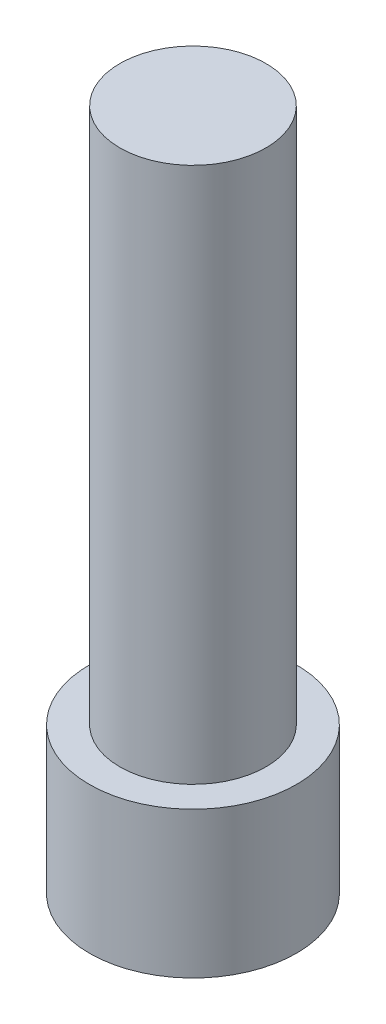
ISO-10303-21;
HEADER;
FILE_DESCRIPTION(('STEP AP214'),'2;1');
FILE_NAME('part.step','',(''),(''),'','','');
FILE_SCHEMA(('AUTOMOTIVE_DESIGN { 1 0 10303 214 1 1 1 1 }'));
ENDSEC;
DATA;
#1=APPLICATION_CONTEXT('core data for automotive mechanical design processes');
#2=APPLICATION_PROTOCOL_DEFINITION('international standard','automotive_design',2000,#1);
#3=PRODUCT_CONTEXT('',#1,'mechanical');
#4=PRODUCT('Part','Part','',(#3));
#5=PRODUCT_RELATED_PRODUCT_CATEGORY('part','',(#4));
#6=PRODUCT_DEFINITION_FORMATION('','',#4);
#7=PRODUCT_DEFINITION_CONTEXT('part definition',#1,'design');
#8=PRODUCT_DEFINITION('design','',#6,#7);
#9=PRODUCT_DEFINITION_SHAPE('','',#8);
#10=(LENGTH_UNIT() NAMED_UNIT(*) SI_UNIT(.MILLI.,.METRE.));
#11=(NAMED_UNIT(*) PLANE_ANGLE_UNIT() SI_UNIT($,.RADIAN.));
#12=(NAMED_UNIT(*) SI_UNIT($,.STERADIAN.) SOLID_ANGLE_UNIT());
#13=UNCERTAINTY_MEASURE_WITH_UNIT(LENGTH_MEASURE(1.E-05),#10,'distance_accuracy_value','');
#14=(GEOMETRIC_REPRESENTATION_CONTEXT(3) GLOBAL_UNCERTAINTY_ASSIGNED_CONTEXT((#13)) GLOBAL_UNIT_ASSIGNED_CONTEXT((#10,
#11,#12)) REPRESENTATION_CONTEXT('',''));
#15=CARTESIAN_POINT('',(0.,0.,0.));
#16=DIRECTION('',(0.,0.,1.));
#17=DIRECTION('',(1.,0.,0.));
#18=AXIS2_PLACEMENT_3D('',#15,#16,#17);
#19=CARTESIAN_POINT('',(0.,6.,0.));
#20=DIRECTION('',(0.,-1.,0.));
#21=DIRECTION('',(0.,0.,-1.));
#22=AXIS2_PLACEMENT_3D('',#19,#20,#21);
#23=CYLINDRICAL_SURFACE('',#22,4.25);
#24=CARTESIAN_POINT('',(0.,6.,0.));
#25=DIRECTION('',(0.,1.,0.));
#26=DIRECTION('',(0.,0.,1.));
#27=AXIS2_PLACEMENT_3D('',#24,#25,#26);
#28=CIRCLE('',#27,4.25);
#29=CARTESIAN_POINT('',(0.,6.,4.25));
#30=VERTEX_POINT('',#29);
#31=EDGE_CURVE('E51',#30,#30,#28,.T.);
#32=ORIENTED_EDGE('',*,*,#31,.F.);
#33=EDGE_LOOP('',(#32));
#34=FACE_BOUND('',#33,.T.);
#35=CARTESIAN_POINT('',(0.,0.,0.));
#36=DIRECTION('',(0.,1.,0.));
#37=DIRECTION('',(0.,0.,1.));
#38=AXIS2_PLACEMENT_3D('',#35,#36,#37);
#39=CIRCLE('',#38,4.25);
#40=CARTESIAN_POINT('',(0.,0.,4.25));
#41=VERTEX_POINT('',#40);
#42=EDGE_CURVE('E46',#41,#41,#39,.T.);
#43=ORIENTED_EDGE('',*,*,#42,.T.);
#44=EDGE_LOOP('',(#43));
#45=FACE_BOUND('',#44,.T.);
#46=ADVANCED_FACE('F43',(#34,#45),#23,.T.);
#47=CARTESIAN_POINT('',(0.,6.,0.));
#48=DIRECTION('',(0.,1.,0.));
#49=DIRECTION('',(0.,0.,1.));
#50=AXIS2_PLACEMENT_3D('',#47,#48,#49);
#51=PLANE('',#50);
#52=CARTESIAN_POINT('',(0.,6.,0.));
#53=DIRECTION('',(0.,1.,0.));
#54=DIRECTION('',(0.,0.,1.));
#55=AXIS2_PLACEMENT_3D('',#52,#53,#54);
#56=CIRCLE('',#55,3.);
#57=CARTESIAN_POINT('',(0.,6.,3.));
#58=VERTEX_POINT('',#57);
#59=EDGE_CURVE('E11',#58,#58,#56,.T.);
#60=ORIENTED_EDGE('',*,*,#59,.F.);
#61=EDGE_LOOP('',(#60));
#62=FACE_BOUND('',#61,.T.);
#63=ORIENTED_EDGE('',*,*,#31,.T.);
#64=EDGE_LOOP('',(#63));
#65=FACE_BOUND('',#64,.T.);
#66=ADVANCED_FACE('F162',(#62,#65),#51,.T.);
#67=CARTESIAN_POINT('',(0.,0.,0.));
#68=DIRECTION('',(0.,1.,0.));
#69=DIRECTION('',(0.,0.,1.));
#70=AXIS2_PLACEMENT_3D('',#67,#68,#69);
#71=PLANE('',#70);
#72=DIRECTION('',(0.091692466270765,0.,0.995787372700209));
#73=VECTOR('',#72,1.);
#74=CARTESIAN_POINT('',(2.3571217565403,0.,-1.66652643488715));
#75=LINE('',#74,#73);
#76=CARTESIAN_POINT('',(2.3571217565403,0.,-1.66652643488715));
#77=VERTEX_POINT('',#76);
#78=CARTESIAN_POINT('',(2.62181510696074,0.,1.20806410353333));
#79=VERTEX_POINT('',#78);
#80=EDGE_CURVE('E134',#77,#79,#75,.T.);
#81=ORIENTED_EDGE('',*,*,#80,.F.);
#82=DIRECTION('',(0.908223394661526,0.,0.418485681223974));
#83=VECTOR('',#82,1.);
#84=CARTESIAN_POINT('',(-0.264693350420435,0.,-2.87459053842048));
#85=LINE('',#84,#83);
#86=CARTESIAN_POINT('',(-0.264693350420435,0.,-2.87459053842048));
#87=VERTEX_POINT('',#86);
#88=EDGE_CURVE('E56',#87,#77,#85,.T.);
#89=ORIENTED_EDGE('',*,*,#88,.F.);
#90=DIRECTION('',(0.816530928390761,0.,-0.577301691476235));
#91=VECTOR('',#90,1.);
#92=CARTESIAN_POINT('',(-2.62181510696074,0.,-1.20806410353333));
#93=LINE('',#92,#91);
#94=CARTESIAN_POINT('',(-2.62181510696074,0.,-1.20806410353333));
#95=VERTEX_POINT('',#94);
#96=EDGE_CURVE('E142',#95,#87,#93,.T.);
#97=ORIENTED_EDGE('',*,*,#96,.F.);
#98=DIRECTION('',(-0.0916924662707653,0.,-0.995787372700209));
#99=VECTOR('',#98,1.);
#100=CARTESIAN_POINT('',(-2.3571217565403,0.,1.66652643488715));
#101=LINE('',#100,#99);
#102=CARTESIAN_POINT('',(-2.3571217565403,0.,1.66652643488715));
#103=VERTEX_POINT('',#102);
#104=EDGE_CURVE('E137',#103,#95,#101,.T.);
#105=ORIENTED_EDGE('',*,*,#104,.F.);
#106=DIRECTION('',(-0.908223394661526,0.,-0.418485681223974));
#107=VECTOR('',#106,1.);
#108=CARTESIAN_POINT('',(0.264693350420435,0.,2.87459053842048));
#109=LINE('',#108,#107);
#110=CARTESIAN_POINT('',(0.264693350420435,0.,2.87459053842048));
#111=VERTEX_POINT('',#110);
#112=EDGE_CURVE('E110',#111,#103,#109,.T.);
#113=ORIENTED_EDGE('',*,*,#112,.F.);
#114=DIRECTION('',(-0.816530928390761,0.,0.577301691476235));
#115=VECTOR('',#114,1.);
#116=CARTESIAN_POINT('',(2.62181510696074,0.,1.20806410353333));
#117=LINE('',#116,#115);
#118=EDGE_CURVE('E139',#79,#111,#117,.T.);
#119=ORIENTED_EDGE('',*,*,#118,.F.);
#120=EDGE_LOOP('',(#81,#89,#97,#105,#113,#119));
#121=FACE_BOUND('',#120,.T.);
#122=ORIENTED_EDGE('',*,*,#42,.F.);
#123=EDGE_LOOP('',(#122));
#124=FACE_BOUND('',#123,.T.);
#125=ADVANCED_FACE('F159',(#121,#124),#71,.F.);
#126=CARTESIAN_POINT('',(0.,28.,0.));
#127=DIRECTION('',(0.,-1.,0.));
#128=DIRECTION('',(0.,0.,-1.));
#129=AXIS2_PLACEMENT_3D('',#126,#127,#128);
#130=CYLINDRICAL_SURFACE('',#129,3.);
#131=CARTESIAN_POINT('',(0.,28.,0.));
#132=DIRECTION('',(0.,1.,0.));
#133=DIRECTION('',(0.,0.,1.));
#134=AXIS2_PLACEMENT_3D('',#131,#132,#133);
#135=CIRCLE('',#134,3.);
#136=CARTESIAN_POINT('',(0.,28.,3.));
#137=VERTEX_POINT('',#136);
#138=EDGE_CURVE('E148',#137,#137,#135,.T.);
#139=ORIENTED_EDGE('',*,*,#138,.F.);
#140=EDGE_LOOP('',(#139));
#141=FACE_BOUND('',#140,.T.);
#142=ORIENTED_EDGE('',*,*,#59,.T.);
#143=EDGE_LOOP('',(#142));
#144=FACE_BOUND('',#143,.T.);
#145=ADVANCED_FACE('F165',(#141,#144),#130,.T.);
#146=CARTESIAN_POINT('',(0.,28.,0.));
#147=DIRECTION('',(0.,1.,0.));
#148=DIRECTION('',(0.,0.,1.));
#149=AXIS2_PLACEMENT_3D('',#146,#147,#148);
#150=PLANE('',#149);
#151=ORIENTED_EDGE('',*,*,#138,.T.);
#152=EDGE_LOOP('',(#151));
#153=FACE_BOUND('',#152,.T.);
#154=ADVANCED_FACE('F168',(#153),#150,.T.);
#155=CARTESIAN_POINT('',(-0.264693350420435,3.,-2.87459053842048));
#156=DIRECTION('',(0.418485681223974,0.,-0.908223394661526));
#157=DIRECTION('',(-0.908223394661526,0.,-0.418485681223974));
#158=AXIS2_PLACEMENT_3D('',#155,#156,#157);
#159=PLANE('',#158);
#160=ORIENTED_EDGE('',*,*,#88,.T.);
#161=DIRECTION('',(0.,-1.,0.));
#162=VECTOR('',#161,1.);
#163=CARTESIAN_POINT('',(2.3571217565403,3.,-1.66652643488715));
#164=LINE('',#163,#162);
#165=CARTESIAN_POINT('',(2.3571217565403,3.,-1.66652643488715));
#166=VERTEX_POINT('',#165);
#167=EDGE_CURVE('E90',#166,#77,#164,.T.);
#168=ORIENTED_EDGE('',*,*,#167,.F.);
#169=DIRECTION('',(0.908223394661526,0.,0.418485681223974));
#170=VECTOR('',#169,1.);
#171=CARTESIAN_POINT('',(-0.264693350420435,3.,-2.87459053842048));
#172=LINE('',#171,#170);
#173=CARTESIAN_POINT('',(-0.264693350420435,3.,-2.87459053842048));
#174=VERTEX_POINT('',#173);
#175=EDGE_CURVE('E145',#174,#166,#172,.T.);
#176=ORIENTED_EDGE('',*,*,#175,.F.);
#177=DIRECTION('',(0.,-1.,0.));
#178=VECTOR('',#177,1.);
#179=CARTESIAN_POINT('',(-0.264693350420435,3.,-2.87459053842048));
#180=LINE('',#179,#178);
#181=EDGE_CURVE('E66',#174,#87,#180,.T.);
#182=ORIENTED_EDGE('',*,*,#181,.T.);
#183=EDGE_LOOP('',(#160,#168,#176,#182));
#184=FACE_BOUND('',#183,.T.);
#185=ADVANCED_FACE('F196',(#184),#159,.F.);
#186=CARTESIAN_POINT('',(-2.62181510696074,3.,-1.20806410353333));
#187=DIRECTION('',(-0.577301691476235,0.,-0.816530928390761));
#188=DIRECTION('',(-0.816530928390761,0.,0.577301691476235));
#189=AXIS2_PLACEMENT_3D('',#186,#187,#188);
#190=PLANE('',#189);
#191=ORIENTED_EDGE('',*,*,#96,.T.);
#192=ORIENTED_EDGE('',*,*,#181,.F.);
#193=DIRECTION('',(0.816530928390761,0.,-0.577301691476235));
#194=VECTOR('',#193,1.);
#195=CARTESIAN_POINT('',(-2.62181510696074,3.,-1.20806410353333));
#196=LINE('',#195,#194);
#197=CARTESIAN_POINT('',(-2.62181510696074,3.,-1.20806410353333));
#198=VERTEX_POINT('',#197);
#199=EDGE_CURVE('E118',#198,#174,#196,.T.);
#200=ORIENTED_EDGE('',*,*,#199,.F.);
#201=DIRECTION('',(0.,-1.,0.));
#202=VECTOR('',#201,1.);
#203=CARTESIAN_POINT('',(-2.62181510696074,3.,-1.20806410353333));
#204=LINE('',#203,#202);
#205=EDGE_CURVE('E112',#198,#95,#204,.T.);
#206=ORIENTED_EDGE('',*,*,#205,.T.);
#207=EDGE_LOOP('',(#191,#192,#200,#206));
#208=FACE_BOUND('',#207,.T.);
#209=ADVANCED_FACE('F209',(#208),#190,.F.);
#210=CARTESIAN_POINT('',(-2.3571217565403,3.,1.66652643488715));
#211=DIRECTION('',(-0.995787372700209,0.,0.0916924662707653));
#212=DIRECTION('',(0.0916924662707653,0.,0.995787372700209));
#213=AXIS2_PLACEMENT_3D('',#210,#211,#212);
#214=PLANE('',#213);
#215=ORIENTED_EDGE('',*,*,#104,.T.);
#216=ORIENTED_EDGE('',*,*,#205,.F.);
#217=DIRECTION('',(-0.0916924662707653,0.,-0.995787372700209));
#218=VECTOR('',#217,1.);
#219=CARTESIAN_POINT('',(-2.3571217565403,3.,1.66652643488715));
#220=LINE('',#219,#218);
#221=CARTESIAN_POINT('',(-2.3571217565403,3.,1.66652643488715));
#222=VERTEX_POINT('',#221);
#223=EDGE_CURVE('E113',#222,#198,#220,.T.);
#224=ORIENTED_EDGE('',*,*,#223,.F.);
#225=DIRECTION('',(0.,-1.,0.));
#226=VECTOR('',#225,1.);
#227=CARTESIAN_POINT('',(-2.3571217565403,3.,1.66652643488715));
#228=LINE('',#227,#226);
#229=EDGE_CURVE('E99',#222,#103,#228,.T.);
#230=ORIENTED_EDGE('',*,*,#229,.T.);
#231=EDGE_LOOP('',(#215,#216,#224,#230));
#232=FACE_BOUND('',#231,.T.);
#233=ADVANCED_FACE('F116',(#232),#214,.F.);
#234=CARTESIAN_POINT('',(0.264693350420435,3.,2.87459053842048));
#235=DIRECTION('',(-0.418485681223974,0.,0.908223394661526));
#236=DIRECTION('',(0.908223394661527,0.,0.418485681223974));
#237=AXIS2_PLACEMENT_3D('',#234,#235,#236);
#238=PLANE('',#237);
#239=ORIENTED_EDGE('',*,*,#112,.T.);
#240=ORIENTED_EDGE('',*,*,#229,.F.);
#241=DIRECTION('',(-0.908223394661526,0.,-0.418485681223974));
#242=VECTOR('',#241,1.);
#243=CARTESIAN_POINT('',(0.264693350420435,3.,2.87459053842048));
#244=LINE('',#243,#242);
#245=CARTESIAN_POINT('',(0.264693350420435,3.,2.87459053842048));
#246=VERTEX_POINT('',#245);
#247=EDGE_CURVE('E102',#246,#222,#244,.T.);
#248=ORIENTED_EDGE('',*,*,#247,.F.);
#249=DIRECTION('',(0.,-1.,0.));
#250=VECTOR('',#249,1.);
#251=CARTESIAN_POINT('',(0.264693350420435,3.,2.87459053842048));
#252=LINE('',#251,#250);
#253=EDGE_CURVE('E115',#246,#111,#252,.T.);
#254=ORIENTED_EDGE('',*,*,#253,.T.);
#255=EDGE_LOOP('',(#239,#240,#248,#254));
#256=FACE_BOUND('',#255,.T.);
#257=ADVANCED_FACE('F105',(#256),#238,.F.);
#258=CARTESIAN_POINT('',(2.62181510696074,3.,1.20806410353333));
#259=DIRECTION('',(0.577301691476235,0.,0.816530928390761));
#260=DIRECTION('',(0.816530928390761,0.,-0.577301691476235));
#261=AXIS2_PLACEMENT_3D('',#258,#259,#260);
#262=PLANE('',#261);
#263=ORIENTED_EDGE('',*,*,#118,.T.);
#264=ORIENTED_EDGE('',*,*,#253,.F.);
#265=DIRECTION('',(-0.816530928390761,0.,0.577301691476235));
#266=VECTOR('',#265,1.);
#267=CARTESIAN_POINT('',(2.62181510696074,3.,1.20806410353333));
#268=LINE('',#267,#266);
#269=CARTESIAN_POINT('',(2.62181510696074,3.,1.20806410353333));
#270=VERTEX_POINT('',#269);
#271=EDGE_CURVE('E122',#270,#246,#268,.T.);
#272=ORIENTED_EDGE('',*,*,#271,.F.);
#273=DIRECTION('',(0.,-1.,0.));
#274=VECTOR('',#273,1.);
#275=CARTESIAN_POINT('',(2.62181510696074,3.,1.20806410353333));
#276=LINE('',#275,#274);
#277=EDGE_CURVE('E149',#270,#79,#276,.T.);
#278=ORIENTED_EDGE('',*,*,#277,.T.);
#279=EDGE_LOOP('',(#263,#264,#272,#278));
#280=FACE_BOUND('',#279,.T.);
#281=ADVANCED_FACE('F232',(#280),#262,.F.);
#282=CARTESIAN_POINT('',(2.3571217565403,3.,-1.66652643488715));
#283=DIRECTION('',(0.995787372700209,0.,-0.091692466270765));
#284=DIRECTION('',(-0.091692466270765,0.,-0.995787372700209));
#285=AXIS2_PLACEMENT_3D('',#282,#283,#284);
#286=PLANE('',#285);
#287=ORIENTED_EDGE('',*,*,#80,.T.);
#288=ORIENTED_EDGE('',*,*,#277,.F.);
#289=DIRECTION('',(0.091692466270765,0.,0.995787372700209));
#290=VECTOR('',#289,1.);
#291=CARTESIAN_POINT('',(2.3571217565403,3.,-1.66652643488715));
#292=LINE('',#291,#290);
#293=EDGE_CURVE('E130',#166,#270,#292,.T.);
#294=ORIENTED_EDGE('',*,*,#293,.F.);
#295=ORIENTED_EDGE('',*,*,#167,.T.);
#296=EDGE_LOOP('',(#287,#288,#294,#295));
#297=FACE_BOUND('',#296,.T.);
#298=ADVANCED_FACE('F243',(#297),#286,.F.);
#299=CARTESIAN_POINT('',(0.,3.,0.));
#300=DIRECTION('',(0.,-1.,0.));
#301=DIRECTION('',(0.,0.,-1.));
#302=AXIS2_PLACEMENT_3D('',#299,#300,#301);
#303=PLANE('',#302);
#304=ORIENTED_EDGE('',*,*,#175,.T.);
#305=ORIENTED_EDGE('',*,*,#293,.T.);
#306=ORIENTED_EDGE('',*,*,#271,.T.);
#307=ORIENTED_EDGE('',*,*,#247,.T.);
#308=ORIENTED_EDGE('',*,*,#223,.T.);
#309=ORIENTED_EDGE('',*,*,#199,.T.);
#310=EDGE_LOOP('',(#304,#305,#306,#307,#308,#309));
#311=FACE_BOUND('',#310,.T.);
#312=ADVANCED_FACE('F121',(#311),#303,.T.);
#313=CLOSED_SHELL('',(#46,#66,#125,#145,#154,#185,#209,#233,#257,#281,#298,#312));
#314=MANIFOLD_SOLID_BREP('B2',#313);
#315=ADVANCED_BREP_SHAPE_REPRESENTATION('',(#18,#314),#14);
#316=SHAPE_DEFINITION_REPRESENTATION(#9,#315);
ENDSEC;
END-ISO-10303-21;
